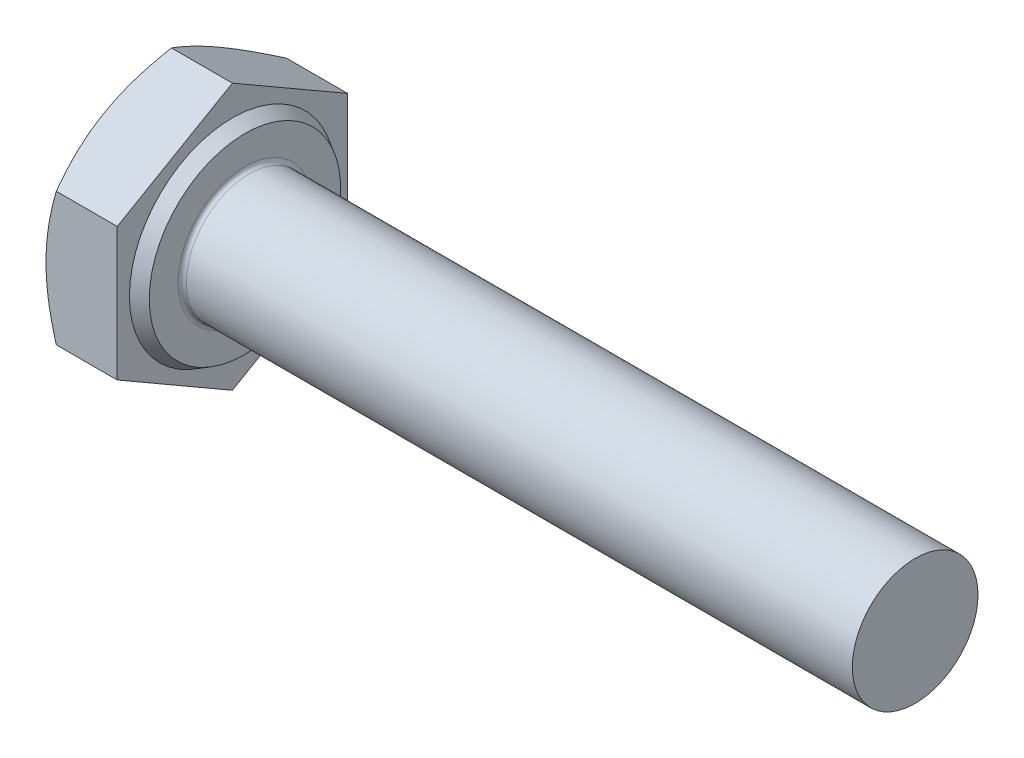
ISO-10303-21;
HEADER;
FILE_DESCRIPTION(('STEP AP214'),'2;1');
FILE_NAME('part.step','',(''),(''),'','','');
FILE_SCHEMA(('AUTOMOTIVE_DESIGN { 1 0 10303 214 1 1 1 1 }'));
ENDSEC;
DATA;
#1=APPLICATION_CONTEXT('core data for automotive mechanical design processes');
#2=APPLICATION_PROTOCOL_DEFINITION('international standard','automotive_design',2000,#1);
#3=PRODUCT_CONTEXT('',#1,'mechanical');
#4=PRODUCT('Part','Part','',(#3));
#5=PRODUCT_RELATED_PRODUCT_CATEGORY('part','',(#4));
#6=PRODUCT_DEFINITION_FORMATION('','',#4);
#7=PRODUCT_DEFINITION_CONTEXT('part definition',#1,'design');
#8=PRODUCT_DEFINITION('design','',#6,#7);
#9=PRODUCT_DEFINITION_SHAPE('','',#8);
#10=(LENGTH_UNIT() NAMED_UNIT(*) SI_UNIT(.MILLI.,.METRE.));
#11=(NAMED_UNIT(*) PLANE_ANGLE_UNIT() SI_UNIT($,.RADIAN.));
#12=(NAMED_UNIT(*) SI_UNIT($,.STERADIAN.) SOLID_ANGLE_UNIT());
#13=UNCERTAINTY_MEASURE_WITH_UNIT(LENGTH_MEASURE(1.E-05),#10,'distance_accuracy_value','');
#14=(GEOMETRIC_REPRESENTATION_CONTEXT(3) GLOBAL_UNCERTAINTY_ASSIGNED_CONTEXT((#13)) GLOBAL_UNIT_ASSIGNED_CONTEXT((#10,
#11,#12)) REPRESENTATION_CONTEXT('',''));
#15=CARTESIAN_POINT('',(0.,0.,0.));
#16=DIRECTION('',(0.,0.,1.));
#17=DIRECTION('',(1.,0.,0.));
#18=AXIS2_PLACEMENT_3D('',#15,#16,#17);
#19=CARTESIAN_POINT('',(0.,0.,0.));
#20=DIRECTION('',(-1.,0.,0.));
#21=DIRECTION('',(0.,0.,1.));
#22=AXIS2_PLACEMENT_3D('',#19,#20,#21);
#23=CYLINDRICAL_SURFACE('',#22,1.5);
#24=CARTESIAN_POINT('',(2.1,0.,0.));
#25=DIRECTION('',(1.,0.,0.));
#26=DIRECTION('',(0.,0.,-1.));
#27=AXIS2_PLACEMENT_3D('',#24,#25,#26);
#28=CIRCLE('',#27,1.5);
#29=CARTESIAN_POINT('',(2.1,0.,-1.5));
#30=VERTEX_POINT('',#29);
#31=EDGE_CURVE('E11',#30,#30,#28,.T.);
#32=ORIENTED_EDGE('',*,*,#31,.T.);
#33=EDGE_LOOP('',(#32));
#34=FACE_BOUND('',#33,.T.);
#35=CARTESIAN_POINT('',(18.,0.,0.));
#36=DIRECTION('',(1.,0.,0.));
#37=DIRECTION('',(0.,0.,-1.));
#38=AXIS2_PLACEMENT_3D('',#35,#36,#37);
#39=CIRCLE('',#38,1.5);
#40=CARTESIAN_POINT('',(18.,0.,-1.5));
#41=VERTEX_POINT('',#40);
#42=EDGE_CURVE('E43',#41,#41,#39,.T.);
#43=ORIENTED_EDGE('',*,*,#42,.F.);
#44=EDGE_LOOP('',(#43));
#45=FACE_BOUND('',#44,.T.);
#46=ADVANCED_FACE('F39',(#34,#45),#23,.T.);
#47=CARTESIAN_POINT('',(2.,1.58771324027148,-2.75));
#48=DIRECTION('',(0.,-0.866025403784438,0.500000000000001));
#49=DIRECTION('',(0.,-0.500000000000001,-0.866025403784438));
#50=AXIS2_PLACEMENT_3D('',#47,#48,#49);
#51=PLANE('',#50);
#52=DIRECTION('',(0.,0.500000000000001,0.866025403784438));
#53=VECTOR('',#52,1.);
#54=CARTESIAN_POINT('',(1.7,1.58771324027148,-2.75));
#55=LINE('',#54,#53);
#56=CARTESIAN_POINT('',(1.7,1.58771324027149,-2.75));
#57=VERTEX_POINT('',#56);
#58=CARTESIAN_POINT('',(1.7,3.17542648054295,0.));
#59=VERTEX_POINT('',#58);
#60=EDGE_CURVE('E117',#57,#59,#55,.T.);
#61=ORIENTED_EDGE('',*,*,#60,.F.);
#62=DIRECTION('',(-1.,0.,0.));
#63=VECTOR('',#62,1.);
#64=CARTESIAN_POINT('',(2.,1.58771324027148,-2.75));
#65=LINE('',#64,#63);
#66=CARTESIAN_POINT('',(0.245620093061863,1.58771324027148,-2.75));
#67=VERTEX_POINT('',#66);
#68=EDGE_CURVE('E251',#57,#67,#65,.T.);
#69=ORIENTED_EDGE('',*,*,#68,.T.);
#70=CARTESIAN_POINT('',(0.245686763364765,3.17554195059679,0.0002));
#71=CARTESIAN_POINT('',(0.205387662249268,3.10576962051744,-0.120649220659906));
#72=CARTESIAN_POINT('',(0.168736902597667,3.03539502097909,-0.242541602622634));
#73=CARTESIAN_POINT('',(0.104762182969805,2.8934271739444,-0.488437126727894));
#74=CARTESIAN_POINT('',(0.0774608556745017,2.82183140359859,-0.612444638573857));
#75=CARTESIAN_POINT('',(0.034961745294121,2.67952717191843,-0.858922797975946));
#76=CARTESIAN_POINT('',(0.0194811186224618,2.60884060771578,-0.98135551858742));
#77=CARTESIAN_POINT('',(0.000999397369944143,2.46713482015519,-1.22679714236892));
#78=CARTESIAN_POINT('',(-0.00201700053739678,2.39611611197038,-1.34980515323292));
#79=CARTESIAN_POINT('',(0.00425314542854981,2.26341005486545,-1.5796587866108));
#80=CARTESIAN_POINT('',(0.0120001542767052,2.20170285541369,-1.68653879125403));
#81=CARTESIAN_POINT('',(0.0365551810643573,2.07869048467395,-1.89960246733475));
#82=CARTESIAN_POINT('',(0.0533715896505728,2.01738573896434,-2.00578540164889));
#83=CARTESIAN_POINT('',(0.0954119223459585,1.89411967378236,-2.21928848939319));
#84=CARTESIAN_POINT('',(0.120814080687233,1.83217395817124,-2.32658161614286));
#85=CARTESIAN_POINT('',(0.178467225839983,1.70920651275308,-2.53956747928405));
#86=CARTESIAN_POINT('',(0.210704663298983,1.64818320715447,-2.64526294502666));
#87=CARTESIAN_POINT('',(0.245686763364761,1.58759777021764,-2.7502));
#88=B_SPLINE_CURVE_WITH_KNOTS('',3,(#70,#71,#72,#73,#74,#75,#76,#77,#78,#79,#80,#81,#82,#83,#84,
#85,#86,#87),.UNSPECIFIED.,.F.,.F.,(4,2,2,2,2,2,2,2,4),(0.,0.43591282872589,0.872873557116335,
1.29901931904672,1.72464171213574,2.09526089052938,2.46622354066375,2.84541551798558,
3.22386274754525),.UNSPECIFIED.);
#89=CARTESIAN_POINT('',(0.,2.38156986040721,-1.375));
#90=VERTEX_POINT('',#89);
#91=EDGE_CURVE('E217',#90,#67,#88,.T.);
#92=ORIENTED_EDGE('',*,*,#91,.F.);
#93=CARTESIAN_POINT('',(0.245620093061867,3.17542648054295,0.));
#94=VERTEX_POINT('',#93);
#95=EDGE_CURVE('E63',#94,#90,#88,.T.);
#96=ORIENTED_EDGE('',*,*,#95,.F.);
#97=DIRECTION('',(-1.,0.,0.));
#98=VECTOR('',#97,1.);
#99=CARTESIAN_POINT('',(2.,3.17542648054295,0.));
#100=LINE('',#99,#98);
#101=EDGE_CURVE('E136',#59,#94,#100,.T.);
#102=ORIENTED_EDGE('',*,*,#101,.F.);
#103=EDGE_LOOP('',(#61,#69,#92,#96,#102));
#104=FACE_BOUND('',#103,.T.);
#105=ADVANCED_FACE('F170',(#104),#51,.F.);
#106=CARTESIAN_POINT('',(2.,3.17542648054295,0.));
#107=DIRECTION('',(0.,-0.866025403784438,-0.500000000000001));
#108=DIRECTION('',(0.,0.500000000000001,-0.866025403784438));
#109=AXIS2_PLACEMENT_3D('',#106,#107,#108);
#110=PLANE('',#109);
#111=DIRECTION('',(0.,-0.500000000000001,0.866025403784438));
#112=VECTOR('',#111,1.);
#113=CARTESIAN_POINT('',(1.7,3.17542648054295,0.));
#114=LINE('',#113,#112);
#115=CARTESIAN_POINT('',(1.7,1.58771324027149,2.75));
#116=VERTEX_POINT('',#115);
#117=EDGE_CURVE('E111',#59,#116,#114,.T.);
#118=ORIENTED_EDGE('',*,*,#117,.F.);
#119=ORIENTED_EDGE('',*,*,#101,.T.);
#120=CARTESIAN_POINT('',(0.245686763364761,1.58759777021764,2.7502));
#121=CARTESIAN_POINT('',(0.205387662249264,1.65737010029699,2.6293507793401));
#122=CARTESIAN_POINT('',(0.168736902597663,1.72774469983534,2.50745839737737));
#123=CARTESIAN_POINT('',(0.104762182969802,1.86971254687003,2.26156287327211));
#124=CARTESIAN_POINT('',(0.0774608556744992,1.94130831721584,2.13755536142615));
#125=CARTESIAN_POINT('',(0.0349617452941192,2.083612548896,1.89107720202406));
#126=CARTESIAN_POINT('',(0.0194811186224604,2.15429911309865,1.76864448141258));
#127=CARTESIAN_POINT('',(0.000999397369943581,2.29600490065924,1.52320285763109));
#128=CARTESIAN_POINT('',(-0.00201700053739682,2.36702360884405,1.40019484676709));
#129=CARTESIAN_POINT('',(0.00425314542855056,2.49972966594898,1.17034121338921));
#130=CARTESIAN_POINT('',(0.0120001542767063,2.56143686540074,1.06346120874598));
#131=CARTESIAN_POINT('',(0.036555181064359,2.68444923614048,0.850397532665251));
#132=CARTESIAN_POINT('',(0.0533715896505747,2.74575398185009,0.744214598351111));
#133=CARTESIAN_POINT('',(0.0954119223459609,2.86902004703208,0.530711510606816));
#134=CARTESIAN_POINT('',(0.120814080687235,2.93096576264319,0.423418383857145));
#135=CARTESIAN_POINT('',(0.178467225839986,3.05393320806135,0.210432520715949));
#136=CARTESIAN_POINT('',(0.210704663298987,3.11495651365996,0.104737054973347));
#137=CARTESIAN_POINT('',(0.245686763364765,3.17554195059679,-0.000199999999999918));
#138=B_SPLINE_CURVE_WITH_KNOTS('',3,(#120,#121,#122,#123,#124,#125,#126,#127,#128,#129,#130,
#131,#132,#133,#134,#135,#136,#137),.UNSPECIFIED.,.F.,.F.,(4,2,2,2,2,2,2,2,4),(0.,
0.435912828725889,0.872873557116334,1.29901931904672,1.72464171213574,2.09526089052938,
2.46622354066375,2.84541551798558,3.22386274754525),.UNSPECIFIED.);
#139=CARTESIAN_POINT('',(0.,2.38156986040721,1.375));
#140=VERTEX_POINT('',#139);
#141=EDGE_CURVE('E237',#140,#94,#138,.T.);
#142=ORIENTED_EDGE('',*,*,#141,.F.);
#143=CARTESIAN_POINT('',(0.245620093061863,1.58771324027148,2.75));
#144=VERTEX_POINT('',#143);
#145=EDGE_CURVE('E135',#144,#140,#138,.T.);
#146=ORIENTED_EDGE('',*,*,#145,.F.);
#147=DIRECTION('',(-1.,0.,0.));
#148=VECTOR('',#147,1.);
#149=CARTESIAN_POINT('',(2.,1.58771324027148,2.75));
#150=LINE('',#149,#148);
#151=EDGE_CURVE('E126',#116,#144,#150,.T.);
#152=ORIENTED_EDGE('',*,*,#151,.F.);
#153=EDGE_LOOP('',(#118,#119,#142,#146,#152));
#154=FACE_BOUND('',#153,.T.);
#155=ADVANCED_FACE('F133',(#154),#110,.F.);
#156=CARTESIAN_POINT('',(2.,1.58771324027148,2.75));
#157=DIRECTION('',(0.,0.,-1.));
#158=DIRECTION('',(-1.,0.,0.));
#159=AXIS2_PLACEMENT_3D('',#156,#157,#158);
#160=PLANE('',#159);
#161=DIRECTION('',(0.,-1.,0.));
#162=VECTOR('',#161,1.);
#163=CARTESIAN_POINT('',(1.7,1.58771324027148,2.75));
#164=LINE('',#163,#162);
#165=CARTESIAN_POINT('',(1.7,-1.58771324027146,2.75000000000002));
#166=VERTEX_POINT('',#165);
#167=EDGE_CURVE('E114',#116,#166,#164,.T.);
#168=ORIENTED_EDGE('',*,*,#167,.F.);
#169=ORIENTED_EDGE('',*,*,#151,.T.);
#170=CARTESIAN_POINT('',(1.36715210704407,-4.31638594918234,2.75));
#171=CARTESIAN_POINT('',(1.30845994096475,-4.19581737051594,2.75));
#172=CARTESIAN_POINT('',(1.25031586425217,-4.07497746694742,2.75));
#173=CARTESIAN_POINT('',(1.1354311974123,-3.83261088383625,2.75));
#174=CARTESIAN_POINT('',(1.07869081888198,-3.71108410410337,2.75));
#175=CARTESIAN_POINT('',(0.966646426591336,-3.46659808789899,2.75));
#176=CARTESIAN_POINT('',(0.911351476138771,-3.34363468385966,2.75));
#177=CARTESIAN_POINT('',(0.802956993957647,-3.09674757673778,2.75));
#178=CARTESIAN_POINT('',(0.749857361778773,-2.97282391790202,2.75));
#179=CARTESIAN_POINT('',(0.644703117588253,-2.71965806564945,2.75));
#180=CARTESIAN_POINT('',(0.592742724367121,-2.59037652858396,2.75));
#181=CARTESIAN_POINT('',(0.492631038352349,-2.33032018429189,2.75));
#182=CARTESIAN_POINT('',(0.444480165603223,-2.19954521421088,2.75));
#183=CARTESIAN_POINT('',(0.353213656190186,-1.93652234449221,2.75));
#184=CARTESIAN_POINT('',(0.310088265151207,-1.80427786301002,2.75));
#185=CARTESIAN_POINT('',(0.23022220963218,-1.53789259482414,2.75));
#186=CARTESIAN_POINT('',(0.193479588678775,-1.40375240288282,2.75));
#187=CARTESIAN_POINT('',(0.128302067791661,-1.13423793476321,2.75));
#188=CARTESIAN_POINT('',(0.0998212369444748,-0.998874970875648,2.75));
#189=CARTESIAN_POINT('',(0.0527456161691629,-0.726413092453879,2.75));
#190=CARTESIAN_POINT('',(0.0341497721022248,-0.589314364619269,2.75));
#191=CARTESIAN_POINT('',(0.00856858652497946,-0.315877662564298,2.75));
#192=CARTESIAN_POINT('',(0.00142992679050953,-0.179554395289445,2.75));
#193=CARTESIAN_POINT('',(-0.0010386746355905,0.093213133937071,2.75));
#194=CARTESIAN_POINT('',(0.00363158744684218,0.229657397936032,2.75));
#195=CARTESIAN_POINT('',(0.0211304631968838,0.459764674388293,2.75));
#196=CARTESIAN_POINT('',(0.0310050171194682,0.553667213671704,2.75));
#197=CARTESIAN_POINT('',(0.0557601395316538,0.740814471055649,2.75));
#198=CARTESIAN_POINT('',(0.0706413439292715,0.834059104056999,2.75));
#199=CARTESIAN_POINT('',(0.122015798898187,1.11266283109749,2.75));
#200=CARTESIAN_POINT('',(0.16523176116353,1.29679769159136,2.75));
#201=CARTESIAN_POINT('',(0.240559912331171,1.57226006867406,2.75));
#202=CARTESIAN_POINT('',(0.267790894506834,1.66500394654353,2.75));
#203=CARTESIAN_POINT('',(0.325176661417267,1.84959145582333,2.75));
#204=CARTESIAN_POINT('',(0.355331468264059,1.94143508041952,2.75));
#205=CARTESIAN_POINT('',(0.418073021824297,2.12425036464147,2.75));
#206=CARTESIAN_POINT('',(0.450659060772914,2.21522226940175,2.75));
#207=CARTESIAN_POINT('',(0.517870145035888,2.39640501304851,2.75));
#208=CARTESIAN_POINT('',(0.552495146383987,2.48661586829763,2.75));
#209=CARTESIAN_POINT('',(0.647111868128754,2.72631941369535,2.75));
#210=CARTESIAN_POINT('',(0.708617133437115,2.87521406734215,2.75));
#211=CARTESIAN_POINT('',(0.835163108096427,3.17149877963135,2.75));
#212=CARTESIAN_POINT('',(0.900204187184538,3.31888867900128,2.75));
#213=CARTESIAN_POINT('',(1.03299372984212,3.61249860697602,2.75));
#214=CARTESIAN_POINT('',(1.1007430819779,3.75871823242042,2.75));
#215=CARTESIAN_POINT('',(1.23832197569377,4.05017738563285,2.75));
#216=CARTESIAN_POINT('',(1.30815157882391,4.19541688424483,2.75));
#217=CARTESIAN_POINT('',(1.52027220806309,4.63039070223181,2.75));
#218=CARTESIAN_POINT('',(1.66499194206912,4.91893915080497,2.75));
#219=CARTESIAN_POINT('',(1.95851426505825,5.49386340867003,2.75));
#220=CARTESIAN_POINT('',(2.10731603787552,5.78023963786974,2.75));
#221=CARTESIAN_POINT('',(2.39216757225534,6.32194576487135,2.75));
#222=CARTESIAN_POINT('',(2.52794261914922,6.5774203700485,2.75));
#223=CARTESIAN_POINT('',(2.80114245272761,7.08750371442347,2.75));
#224=CARTESIAN_POINT('',(2.93856733551165,7.34211240206401,2.75));
#225=CARTESIAN_POINT('',(3.21419429818605,7.84983547824257,2.75));
#226=CARTESIAN_POINT('',(3.35239239225702,8.10295203313655,2.75));
#227=CARTESIAN_POINT('',(3.62973059253268,8.60864374493557,2.75));
#228=CARTESIAN_POINT('',(3.7688706263896,8.86121894150221,2.75));
#229=CARTESIAN_POINT('',(3.9083538925964,9.11360311770116,2.75));
#230=B_SPLINE_CURVE_WITH_KNOTS('',3,(#170,#171,#172,#173,#174,#175,#176,#177,#178,#179,#180,
#181,#182,#183,#184,#185,#186,#187,#188,#189,#190,#191,#192,#193,#194,#195,#196,#197,#198,#199,
#200,#201,#202,#203,#204,#205,#206,#207,#208,#209,#210,#211,#212,#213,#214,#215,#216,#217,#218,
#219,#220,#221,#222,#223,#224,#225,#226,#227,#228,#229),.UNSPECIFIED.,.F.,.F.,(4,2,2,2,2,2,2,2,
2,2,2,2,2,2,2,2,2,2,2,2,2,2,2,2,2,2,2,2,2,4),(0.,0.402290608258892,0.804641493784548,
1.20909649725656,1.6135329737118,2.03148461048146,2.44948226730266,2.86665458560836,
3.28369880400759,3.69837799217318,4.11301294991384,4.52205162226936,4.93109735302041,
5.21422195546487,5.49738253190367,6.06398562819834,6.35393648052213,6.6438895258295,
6.933758488749,7.2236212034952,7.70684704660549,8.19012351781084,8.67355987154436,
9.15701054332953,10.1253686031769,11.0935344400116,11.9614658313278,12.8294480255313,
13.694604925882,14.559696113279),.UNSPECIFIED.);
#231=CARTESIAN_POINT('',(0.,0.,2.75));
#232=VERTEX_POINT('',#231);
#233=EDGE_CURVE('E243',#232,#144,#230,.T.);
#234=ORIENTED_EDGE('',*,*,#233,.F.);
#235=CARTESIAN_POINT('',(0.245620093061861,-1.58771324027147,2.75));
#236=VERTEX_POINT('',#235);
#237=EDGE_CURVE('E249',#236,#232,#230,.T.);
#238=ORIENTED_EDGE('',*,*,#237,.F.);
#239=DIRECTION('',(-1.,0.,0.));
#240=VECTOR('',#239,1.);
#241=CARTESIAN_POINT('',(2.,-1.58771324027147,2.75));
#242=LINE('',#241,#240);
#243=EDGE_CURVE('E129',#166,#236,#242,.T.);
#244=ORIENTED_EDGE('',*,*,#243,.F.);
#245=EDGE_LOOP('',(#168,#169,#234,#238,#244));
#246=FACE_BOUND('',#245,.T.);
#247=ADVANCED_FACE('F124',(#246),#160,.F.);
#248=CARTESIAN_POINT('',(2.,-3.17542648054295,0.));
#249=DIRECTION('',(0.,0.866025403784438,-0.500000000000001));
#250=DIRECTION('',(0.,0.500000000000001,0.866025403784438));
#251=AXIS2_PLACEMENT_3D('',#248,#249,#250);
#252=PLANE('',#251);
#253=DIRECTION('',(0.,-0.500000000000001,-0.866025403784438));
#254=VECTOR('',#253,1.);
#255=CARTESIAN_POINT('',(1.7,-3.17542648054295,0.));
#256=LINE('',#255,#254);
#257=CARTESIAN_POINT('',(1.7,-3.17542648054295,0.));
#258=VERTEX_POINT('',#257);
#259=EDGE_CURVE('E130',#166,#258,#256,.T.);
#260=ORIENTED_EDGE('',*,*,#259,.F.);
#261=ORIENTED_EDGE('',*,*,#243,.T.);
#262=CARTESIAN_POINT('',(0.245686763364761,-3.17554195059679,-0.000200000000003496));
#263=CARTESIAN_POINT('',(0.205387662249264,-3.10576962051743,0.120649220659903));
#264=CARTESIAN_POINT('',(0.168736902597663,-3.03539502097909,0.242541602622631));
#265=CARTESIAN_POINT('',(0.104762182969801,-2.89342717394439,0.48843712672789));
#266=CARTESIAN_POINT('',(0.077460855674498,-2.82183140359859,0.612444638573853));
#267=CARTESIAN_POINT('',(0.0349617452941171,-2.67952717191843,0.858922797975941));
#268=CARTESIAN_POINT('',(0.0194811186224577,-2.60884060771578,0.981355518587415));
#269=CARTESIAN_POINT('',(0.000999397369939871,-2.46713482015519,1.22679714236891));
#270=CARTESIAN_POINT('',(-0.00201700053740103,-2.39611611197038,1.34980515323291));
#271=CARTESIAN_POINT('',(0.0042531454285458,-2.26341005486545,1.57965878661079));
#272=CARTESIAN_POINT('',(0.0120001542767015,-2.20170285541369,1.68653879125402));
#273=CARTESIAN_POINT('',(0.0365551810643536,-2.07869048467395,1.89960246733475));
#274=CARTESIAN_POINT('',(0.0533715896505688,-2.01738573896434,2.00578540164889));
#275=CARTESIAN_POINT('',(0.0954119223459545,-1.89411967378235,2.21928848939318));
#276=CARTESIAN_POINT('',(0.120814080687229,-1.83217395817123,2.32658161614286));
#277=CARTESIAN_POINT('',(0.17846722583998,-1.70920651275308,2.53956747928405));
#278=CARTESIAN_POINT('',(0.210704663298981,-1.64818320715446,2.64526294502665));
#279=CARTESIAN_POINT('',(0.245686763364759,-1.58759777021763,2.7502));
#280=B_SPLINE_CURVE_WITH_KNOTS('',3,(#262,#263,#264,#265,#266,#267,#268,#269,#270,#271,#272,
#273,#274,#275,#276,#277,#278,#279),.UNSPECIFIED.,.F.,.F.,(4,2,2,2,2,2,2,2,4),(0.,
0.435912828725889,0.872873557116333,1.29901931904672,1.72464171213574,2.09526089052938,
2.46622354066375,2.84541551798558,3.22386274754525),.UNSPECIFIED.);
#281=CARTESIAN_POINT('',(0.,-2.38156986040721,1.375));
#282=VERTEX_POINT('',#281);
#283=EDGE_CURVE('E250',#282,#236,#280,.T.);
#284=ORIENTED_EDGE('',*,*,#283,.F.);
#285=CARTESIAN_POINT('',(0.245620093061863,-3.17542648054295,0.));
#286=VERTEX_POINT('',#285);
#287=EDGE_CURVE('E225',#286,#282,#280,.T.);
#288=ORIENTED_EDGE('',*,*,#287,.F.);
#289=DIRECTION('',(-1.,0.,0.));
#290=VECTOR('',#289,1.);
#291=CARTESIAN_POINT('',(2.,-3.17542648054295,0.));
#292=LINE('',#291,#290);
#293=EDGE_CURVE('E140',#258,#286,#292,.T.);
#294=ORIENTED_EDGE('',*,*,#293,.F.);
#295=EDGE_LOOP('',(#260,#261,#284,#288,#294));
#296=FACE_BOUND('',#295,.T.);
#297=ADVANCED_FACE('F267',(#296),#252,.F.);
#298=CARTESIAN_POINT('',(2.,-1.58771324027147,-2.75));
#299=DIRECTION('',(0.,0.866025403784437,0.500000000000003));
#300=DIRECTION('',(0.,-0.500000000000003,0.866025403784437));
#301=AXIS2_PLACEMENT_3D('',#298,#299,#300);
#302=PLANE('',#301);
#303=DIRECTION('',(0.,0.500000000000003,-0.866025403784437));
#304=VECTOR('',#303,1.);
#305=CARTESIAN_POINT('',(1.7,-1.58771324027147,-2.75));
#306=LINE('',#305,#304);
#307=CARTESIAN_POINT('',(1.7,-1.58771324027147,-2.75));
#308=VERTEX_POINT('',#307);
#309=EDGE_CURVE('E55',#258,#308,#306,.T.);
#310=ORIENTED_EDGE('',*,*,#309,.F.);
#311=ORIENTED_EDGE('',*,*,#293,.T.);
#312=CARTESIAN_POINT('',(0.245686763364758,-1.58759777021763,-2.7502));
#313=CARTESIAN_POINT('',(0.205387662249261,-1.65737010029698,-2.6293507793401));
#314=CARTESIAN_POINT('',(0.16873690259766,-1.72774469983533,-2.50745839737737));
#315=CARTESIAN_POINT('',(0.104762182969799,-1.86971254687002,-2.26156287327211));
#316=CARTESIAN_POINT('',(0.0774608556744961,-1.94130831721583,-2.13755536142615));
#317=CARTESIAN_POINT('',(0.0349617452941159,-2.08361254889599,-1.89107720202406));
#318=CARTESIAN_POINT('',(0.0194811186224571,-2.15429911309864,-1.76864448141259));
#319=CARTESIAN_POINT('',(0.000999397369939992,-2.29600490065923,-1.52320285763109));
#320=CARTESIAN_POINT('',(-0.00201700053740066,-2.36702360884404,-1.40019484676709));
#321=CARTESIAN_POINT('',(0.00425314542854642,-2.49972966594897,-1.17034121338921));
#322=CARTESIAN_POINT('',(0.0120001542767021,-2.56143686540073,-1.06346120874598));
#323=CARTESIAN_POINT('',(0.0365551810643547,-2.68444923614047,-0.850397532665255));
#324=CARTESIAN_POINT('',(0.0533715896505705,-2.74575398185008,-0.744214598351116));
#325=CARTESIAN_POINT('',(0.0954119223459569,-2.86902004703207,-0.530711510606821));
#326=CARTESIAN_POINT('',(0.120814080687231,-2.93096576264319,-0.423418383857149));
#327=CARTESIAN_POINT('',(0.178467225839983,-3.05393320806134,-0.210432520715952));
#328=CARTESIAN_POINT('',(0.210704663298983,-3.11495651365996,-0.104737054973351));
#329=CARTESIAN_POINT('',(0.245686763364761,-3.17554195059679,0.000199999999996635));
#330=B_SPLINE_CURVE_WITH_KNOTS('',3,(#312,#313,#314,#315,#316,#317,#318,#319,#320,#321,#322,
#323,#324,#325,#326,#327,#328,#329),.UNSPECIFIED.,.F.,.F.,(4,2,2,2,2,2,2,2,4),(0.,
0.435912828725888,0.872873557116332,1.29901931904672,1.72464171213574,2.09526089052938,
2.46622354066374,2.84541551798557,3.22386274754525),.UNSPECIFIED.);
#331=CARTESIAN_POINT('',(0.,-2.3815698604072,-1.37500000000001));
#332=VERTEX_POINT('',#331);
#333=EDGE_CURVE('E218',#332,#286,#330,.T.);
#334=ORIENTED_EDGE('',*,*,#333,.F.);
#335=CARTESIAN_POINT('',(0.245620093061748,-1.58771324027164,-2.75));
#336=VERTEX_POINT('',#335);
#337=EDGE_CURVE('E210',#336,#332,#330,.T.);
#338=ORIENTED_EDGE('',*,*,#337,.F.);
#339=DIRECTION('',(-1.,0.,0.));
#340=VECTOR('',#339,1.);
#341=CARTESIAN_POINT('',(2.,-1.58771324027147,-2.75));
#342=LINE('',#341,#340);
#343=EDGE_CURVE('E253',#308,#336,#342,.T.);
#344=ORIENTED_EDGE('',*,*,#343,.F.);
#345=EDGE_LOOP('',(#310,#311,#334,#338,#344));
#346=FACE_BOUND('',#345,.T.);
#347=ADVANCED_FACE('F194',(#346),#302,.F.);
#348=CARTESIAN_POINT('',(2.,1.58771324027148,-2.75));
#349=DIRECTION('',(0.,0.,1.));
#350=DIRECTION('',(1.,0.,0.));
#351=AXIS2_PLACEMENT_3D('',#348,#349,#350);
#352=PLANE('',#351);
#353=DIRECTION('',(0.,1.,0.));
#354=VECTOR('',#353,1.);
#355=CARTESIAN_POINT('',(1.7,1.58771324027148,-2.75));
#356=LINE('',#355,#354);
#357=EDGE_CURVE('E148',#308,#57,#356,.T.);
#358=ORIENTED_EDGE('',*,*,#357,.F.);
#359=ORIENTED_EDGE('',*,*,#343,.T.);
#360=CARTESIAN_POINT('',(1.36715210704407,-4.31638594918234,-2.75));
#361=CARTESIAN_POINT('',(1.30845994096475,-4.19581737051594,-2.75));
#362=CARTESIAN_POINT('',(1.25031586425217,-4.07497746694741,-2.75));
#363=CARTESIAN_POINT('',(1.1354311974123,-3.83261088383625,-2.75));
#364=CARTESIAN_POINT('',(1.07869081888198,-3.71108410410336,-2.75));
#365=CARTESIAN_POINT('',(0.966646426591334,-3.46659808789899,-2.75));
#366=CARTESIAN_POINT('',(0.911351476138769,-3.34363468385965,-2.75));
#367=CARTESIAN_POINT('',(0.802956993957645,-3.09674757673778,-2.75));
#368=CARTESIAN_POINT('',(0.749857361778772,-2.97282391790201,-2.75));
#369=CARTESIAN_POINT('',(0.644703117588252,-2.71965806564944,-2.75));
#370=CARTESIAN_POINT('',(0.59274272436712,-2.59037652858396,-2.75));
#371=CARTESIAN_POINT('',(0.492631038352348,-2.33032018429189,-2.75));
#372=CARTESIAN_POINT('',(0.444480165603222,-2.19954521421088,-2.75));
#373=CARTESIAN_POINT('',(0.353213656190184,-1.9365223444922,-2.75));
#374=CARTESIAN_POINT('',(0.310088265151206,-1.80427786301002,-2.75));
#375=CARTESIAN_POINT('',(0.230222209632179,-1.53789259482414,-2.75));
#376=CARTESIAN_POINT('',(0.193479588678774,-1.40375240288282,-2.75));
#377=CARTESIAN_POINT('',(0.12830206779166,-1.13423793476321,-2.75));
#378=CARTESIAN_POINT('',(0.0998212369444743,-0.998874970875645,-2.75));
#379=CARTESIAN_POINT('',(0.0527456161691624,-0.726413092453876,-2.75));
#380=CARTESIAN_POINT('',(0.0341497721022244,-0.589314364619266,-2.75));
#381=CARTESIAN_POINT('',(0.00856858652497935,-0.315877662564295,-2.75));
#382=CARTESIAN_POINT('',(0.00142992679050954,-0.179554395289442,-2.75));
#383=CARTESIAN_POINT('',(-0.0010386746355905,0.0932131339370735,-2.75));
#384=CARTESIAN_POINT('',(0.00363158744684206,0.229657397936034,-2.75));
#385=CARTESIAN_POINT('',(0.0211304631968839,0.459764674388296,-2.75));
#386=CARTESIAN_POINT('',(0.0310050171194685,0.553667213671707,-2.75));
#387=CARTESIAN_POINT('',(0.0557601395316545,0.740814471055653,-2.75));
#388=CARTESIAN_POINT('',(0.0706413439292722,0.834059104057003,-2.75));
#389=CARTESIAN_POINT('',(0.122015798898188,1.1126628310975,-2.75));
#390=CARTESIAN_POINT('',(0.165231761163531,1.29679769159136,-2.75));
#391=CARTESIAN_POINT('',(0.240559912331172,1.57226006867406,-2.75));
#392=CARTESIAN_POINT('',(0.267790894506835,1.66500394654354,-2.75));
#393=CARTESIAN_POINT('',(0.325176661417269,1.84959145582334,-2.75));
#394=CARTESIAN_POINT('',(0.355331468264061,1.94143508041952,-2.75));
#395=CARTESIAN_POINT('',(0.418073021824299,2.12425036464147,-2.75));
#396=CARTESIAN_POINT('',(0.450659060772916,2.21522226940175,-2.75));
#397=CARTESIAN_POINT('',(0.51787014503589,2.39640501304852,-2.75));
#398=CARTESIAN_POINT('',(0.552495146383989,2.48661586829763,-2.75));
#399=CARTESIAN_POINT('',(0.647111868128757,2.72631941369536,-2.75));
#400=CARTESIAN_POINT('',(0.708617133437117,2.87521406734216,-2.75));
#401=CARTESIAN_POINT('',(0.835163108096429,3.17149877963135,-2.75));
#402=CARTESIAN_POINT('',(0.900204187184541,3.31888867900129,-2.75));
#403=CARTESIAN_POINT('',(1.03299372984212,3.61249860697602,-2.75));
#404=CARTESIAN_POINT('',(1.1007430819779,3.75871823242042,-2.75));
#405=CARTESIAN_POINT('',(1.23832197569378,4.05017738563286,-2.75));
#406=CARTESIAN_POINT('',(1.30815157882392,4.19541688424483,-2.75));
#407=CARTESIAN_POINT('',(1.5202722080631,4.63039070223182,-2.75));
#408=CARTESIAN_POINT('',(1.66499194206912,4.91893915080498,-2.75));
#409=CARTESIAN_POINT('',(1.95851426505825,5.49386340867004,-2.75));
#410=CARTESIAN_POINT('',(2.10731603787552,5.78023963786975,-2.75));
#411=CARTESIAN_POINT('',(2.39216757225535,6.32194576487135,-2.75));
#412=CARTESIAN_POINT('',(2.52794261914923,6.5774203700485,-2.75));
#413=CARTESIAN_POINT('',(2.80114245272761,7.08750371442348,-2.75));
#414=CARTESIAN_POINT('',(2.93856733551165,7.34211240206401,-2.75));
#415=CARTESIAN_POINT('',(3.21419429818605,7.84983547824258,-2.75));
#416=CARTESIAN_POINT('',(3.35239239225702,8.10295203313656,-2.75));
#417=CARTESIAN_POINT('',(3.62973059253268,8.60864374493558,-2.75));
#418=CARTESIAN_POINT('',(3.7688706263896,8.86121894150221,-2.75));
#419=CARTESIAN_POINT('',(3.9083538925964,9.11360311770116,-2.75));
#420=B_SPLINE_CURVE_WITH_KNOTS('',3,(#360,#361,#362,#363,#364,#365,#366,#367,#368,#369,#370,
#371,#372,#373,#374,#375,#376,#377,#378,#379,#380,#381,#382,#383,#384,#385,#386,#387,#388,#389,
#390,#391,#392,#393,#394,#395,#396,#397,#398,#399,#400,#401,#402,#403,#404,#405,#406,#407,#408,
#409,#410,#411,#412,#413,#414,#415,#416,#417,#418,#419),.UNSPECIFIED.,.F.,.F.,(4,2,2,2,2,2,2,2,
2,2,2,2,2,2,2,2,2,2,2,2,2,2,2,2,2,2,2,2,2,4),(0.,0.402290608258891,0.804641493784548,
1.20909649725656,1.6135329737118,2.03148461048146,2.44948226730266,2.86665458560836,
3.28369880400759,3.69837799217317,4.11301294991384,4.52205162226936,4.93109735302041,
5.21422195546487,5.49738253190367,6.06398562819834,6.35393648052213,6.6438895258295,
6.933758488749,7.22362120349521,7.7068470466055,8.19012351781085,8.67355987154437,
9.15701054332954,10.1253686031769,11.0935344400116,11.9614658313278,12.8294480255313,
13.694604925882,14.559696113279),.UNSPECIFIED.);
#421=CARTESIAN_POINT('',(0.,0.,-2.75));
#422=VERTEX_POINT('',#421);
#423=EDGE_CURVE('E199',#422,#336,#420,.F.);
#424=ORIENTED_EDGE('',*,*,#423,.F.);
#425=EDGE_CURVE('E207',#67,#422,#420,.F.);
#426=ORIENTED_EDGE('',*,*,#425,.F.);
#427=ORIENTED_EDGE('',*,*,#68,.F.);
#428=EDGE_LOOP('',(#358,#359,#424,#426,#427));
#429=FACE_BOUND('',#428,.T.);
#430=ADVANCED_FACE('F189',(#429),#352,.F.);
#431=CARTESIAN_POINT('',(0.,0.,0.));
#432=DIRECTION('',(1.,0.,0.));
#433=DIRECTION('',(0.,0.,-1.));
#434=AXIS2_PLACEMENT_3D('',#431,#432,#433);
#435=CONICAL_SURFACE('',#434,2.75,1.0471975511966);
#436=ORIENTED_EDGE('',*,*,#337,.T.);
#437=CARTESIAN_POINT('',(0.,0.,0.));
#438=DIRECTION('',(1.,0.,0.));
#439=DIRECTION('',(0.,0.,-1.));
#440=AXIS2_PLACEMENT_3D('',#437,#438,#439);
#441=CIRCLE('',#440,2.75);
#442=EDGE_CURVE('E138',#332,#422,#441,.T.);
#443=ORIENTED_EDGE('',*,*,#442,.T.);
#444=ORIENTED_EDGE('',*,*,#423,.T.);
#445=EDGE_LOOP('',(#436,#443,#444));
#446=FACE_BOUND('',#445,.T.);
#447=ADVANCED_FACE('F193',(#446),#435,.T.);
#448=ORIENTED_EDGE('',*,*,#287,.T.);
#449=EDGE_CURVE('E146',#282,#332,#441,.T.);
#450=ORIENTED_EDGE('',*,*,#449,.T.);
#451=ORIENTED_EDGE('',*,*,#333,.T.);
#452=EDGE_LOOP('',(#448,#450,#451));
#453=FACE_BOUND('',#452,.T.);
#454=ADVANCED_FACE('F263',(#453),#435,.T.);
#455=ORIENTED_EDGE('',*,*,#237,.T.);
#456=EDGE_CURVE('E279',#232,#282,#441,.T.);
#457=ORIENTED_EDGE('',*,*,#456,.T.);
#458=ORIENTED_EDGE('',*,*,#283,.T.);
#459=EDGE_LOOP('',(#455,#457,#458));
#460=FACE_BOUND('',#459,.T.);
#461=ADVANCED_FACE('F180',(#460),#435,.T.);
#462=ORIENTED_EDGE('',*,*,#233,.T.);
#463=ORIENTED_EDGE('',*,*,#145,.T.);
#464=CARTESIAN_POINT('',(0.,0.,0.));
#465=DIRECTION('',(-1.,0.,0.));
#466=DIRECTION('',(0.,0.,1.));
#467=AXIS2_PLACEMENT_3D('',#464,#465,#466);
#468=CIRCLE('',#467,2.75);
#469=EDGE_CURVE('E208',#232,#140,#468,.T.);
#470=ORIENTED_EDGE('',*,*,#469,.F.);
#471=EDGE_LOOP('',(#462,#463,#470));
#472=FACE_BOUND('',#471,.T.);
#473=ADVANCED_FACE('F272',(#472),#435,.T.);
#474=ORIENTED_EDGE('',*,*,#141,.T.);
#475=ORIENTED_EDGE('',*,*,#95,.T.);
#476=EDGE_CURVE('E276',#90,#140,#441,.T.);
#477=ORIENTED_EDGE('',*,*,#476,.T.);
#478=EDGE_LOOP('',(#474,#475,#477));
#479=FACE_BOUND('',#478,.T.);
#480=ADVANCED_FACE('F277',(#479),#435,.T.);
#481=ORIENTED_EDGE('',*,*,#91,.T.);
#482=ORIENTED_EDGE('',*,*,#425,.T.);
#483=EDGE_CURVE('E147',#422,#90,#441,.T.);
#484=ORIENTED_EDGE('',*,*,#483,.T.);
#485=EDGE_LOOP('',(#481,#482,#484));
#486=FACE_BOUND('',#485,.T.);
#487=ADVANCED_FACE('F187',(#486),#435,.T.);
#488=CARTESIAN_POINT('',(0.,0.,-5.49999999999999));
#489=DIRECTION('',(1.,0.,0.));
#490=DIRECTION('',(0.,0.,-1.));
#491=AXIS2_PLACEMENT_3D('',#488,#489,#490);
#492=PLANE('',#491);
#493=ORIENTED_EDGE('',*,*,#483,.F.);
#494=ORIENTED_EDGE('',*,*,#442,.F.);
#495=ORIENTED_EDGE('',*,*,#449,.F.);
#496=ORIENTED_EDGE('',*,*,#456,.F.);
#497=ORIENTED_EDGE('',*,*,#469,.T.);
#498=ORIENTED_EDGE('',*,*,#476,.F.);
#499=EDGE_LOOP('',(#493,#494,#495,#496,#497,#498));
#500=FACE_BOUND('',#499,.T.);
#501=ADVANCED_FACE('F184',(#500),#492,.F.);
#502=CARTESIAN_POINT('',(1.7,2.45820508075689,0.));
#503=DIRECTION('',(1.,0.,0.));
#504=DIRECTION('',(0.,0.,-1.));
#505=AXIS2_PLACEMENT_3D('',#502,#503,#504);
#506=PLANE('',#505);
#507=CARTESIAN_POINT('',(1.7,0.,0.));
#508=DIRECTION('',(-1.,0.,0.));
#509=DIRECTION('',(0.,0.,1.));
#510=AXIS2_PLACEMENT_3D('',#507,#508,#509);
#511=CIRCLE('',#510,2.45820508075689);
#512=CARTESIAN_POINT('',(1.7,0.,2.45820508075689));
#513=VERTEX_POINT('',#512);
#514=EDGE_CURVE('E421',#513,#513,#511,.T.);
#515=ORIENTED_EDGE('',*,*,#514,.T.);
#516=EDGE_LOOP('',(#515));
#517=FACE_BOUND('',#516,.T.);
#518=ORIENTED_EDGE('',*,*,#60,.T.);
#519=ORIENTED_EDGE('',*,*,#117,.T.);
#520=ORIENTED_EDGE('',*,*,#167,.T.);
#521=ORIENTED_EDGE('',*,*,#259,.T.);
#522=ORIENTED_EDGE('',*,*,#309,.T.);
#523=ORIENTED_EDGE('',*,*,#357,.T.);
#524=EDGE_LOOP('',(#518,#519,#520,#521,#522,#523));
#525=FACE_BOUND('',#524,.T.);
#526=ADVANCED_FACE('F113',(#517,#525),#506,.T.);
#527=CARTESIAN_POINT('',(1.7,0.,0.));
#528=DIRECTION('',(-1.,0.,0.));
#529=DIRECTION('',(0.,0.,1.));
#530=AXIS2_PLACEMENT_3D('',#527,#528,#529);
#531=CONICAL_SURFACE('',#530,2.45820508075689,0.523598775598295);
#532=CARTESIAN_POINT('',(1.99999999999999,0.,0.));
#533=DIRECTION('',(-1.,0.,0.));
#534=DIRECTION('',(0.,0.,1.));
#535=AXIS2_PLACEMENT_3D('',#532,#533,#534);
#536=CIRCLE('',#535,2.285);
#537=CARTESIAN_POINT('',(1.99999999999999,0.,2.285));
#538=VERTEX_POINT('',#537);
#539=EDGE_CURVE('E418',#538,#538,#536,.T.);
#540=ORIENTED_EDGE('',*,*,#539,.T.);
#541=EDGE_LOOP('',(#540));
#542=FACE_BOUND('',#541,.T.);
#543=ORIENTED_EDGE('',*,*,#514,.F.);
#544=EDGE_LOOP('',(#543));
#545=FACE_BOUND('',#544,.T.);
#546=ADVANCED_FACE('F166',(#542,#545),#531,.T.);
#547=CARTESIAN_POINT('',(2.,0.,-5.49999999999999));
#548=DIRECTION('',(1.,0.,0.));
#549=DIRECTION('',(0.,0.,-1.));
#550=AXIS2_PLACEMENT_3D('',#547,#548,#549);
#551=PLANE('',#550);
#552=CARTESIAN_POINT('',(2.,0.,0.));
#553=DIRECTION('',(1.,0.,0.));
#554=DIRECTION('',(0.,0.,-1.));
#555=AXIS2_PLACEMENT_3D('',#552,#553,#554);
#556=CIRCLE('',#555,1.6);
#557=CARTESIAN_POINT('',(2.,0.,-1.6));
#558=VERTEX_POINT('',#557);
#559=EDGE_CURVE('E48',#558,#558,#556,.F.);
#560=ORIENTED_EDGE('',*,*,#559,.T.);
#561=EDGE_LOOP('',(#560));
#562=FACE_BOUND('',#561,.T.);
#563=ORIENTED_EDGE('',*,*,#539,.F.);
#564=EDGE_LOOP('',(#563));
#565=FACE_BOUND('',#564,.T.);
#566=ADVANCED_FACE('F153',(#562,#565),#551,.T.);
#567=CARTESIAN_POINT('',(2.1,0.,0.));
#568=DIRECTION('',(1.,0.,0.));
#569=DIRECTION('',(0.,0.,-1.));
#570=AXIS2_PLACEMENT_3D('',#567,#568,#569);
#571=TOROIDAL_SURFACE('',#570,1.6,0.1);
#572=ORIENTED_EDGE('',*,*,#31,.F.);
#573=EDGE_LOOP('',(#572));
#574=FACE_BOUND('',#573,.T.);
#575=ORIENTED_EDGE('',*,*,#559,.F.);
#576=EDGE_LOOP('',(#575));
#577=FACE_BOUND('',#576,.T.);
#578=ADVANCED_FACE('F41',(#574,#577),#571,.F.);
#579=CARTESIAN_POINT('',(18.,0.,0.));
#580=DIRECTION('',(1.,0.,0.));
#581=DIRECTION('',(0.,0.,-1.));
#582=AXIS2_PLACEMENT_3D('',#579,#580,#581);
#583=PLANE('',#582);
#584=ORIENTED_EDGE('',*,*,#42,.T.);
#585=EDGE_LOOP('',(#584));
#586=FACE_BOUND('',#585,.T.);
#587=ADVANCED_FACE('F157',(#586),#583,.T.);
#588=CLOSED_SHELL('',(#46,#105,#155,#247,#297,#347,#430,#447,#454,#461,#473,#480,#487,#501,#526,
#546,#566,#578,#587));
#589=MANIFOLD_SOLID_BREP('B2',#588);
#590=ADVANCED_BREP_SHAPE_REPRESENTATION('',(#18,#589),#14);
#591=SHAPE_DEFINITION_REPRESENTATION(#9,#590);
ENDSEC;
END-ISO-10303-21;
